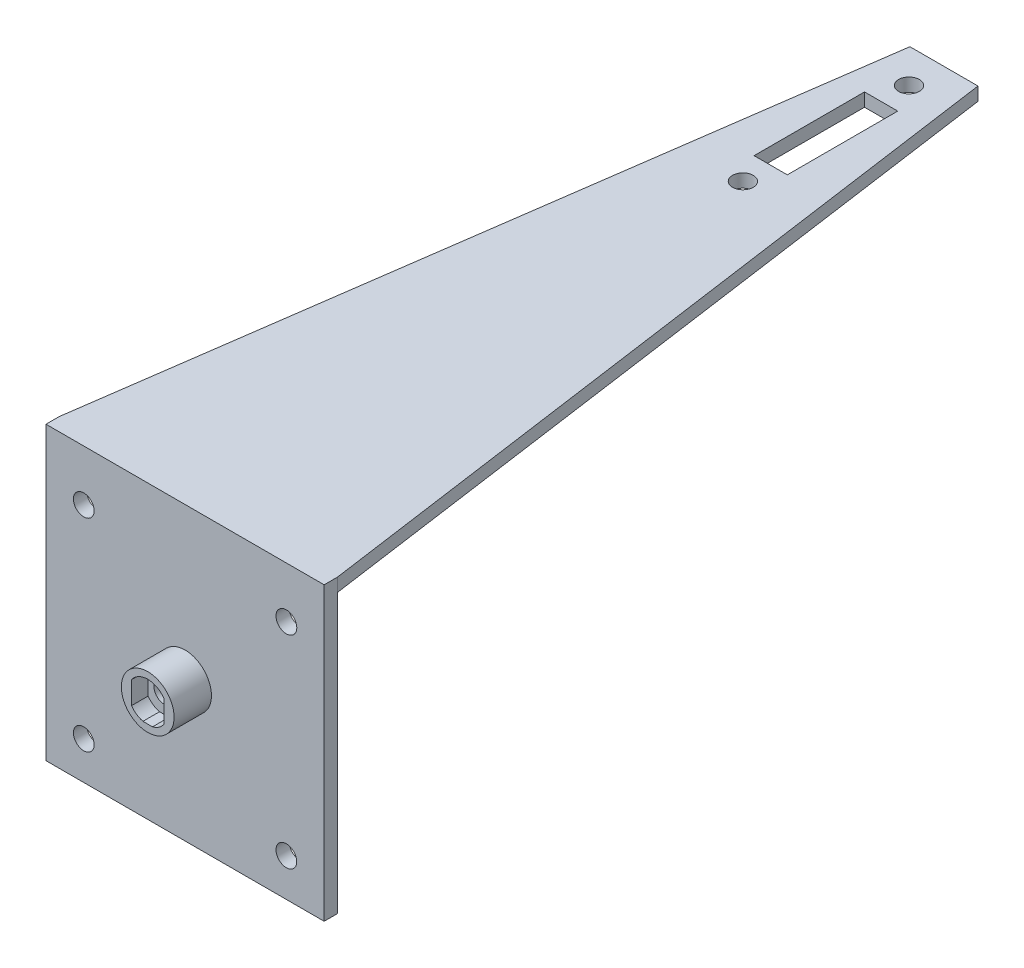
ISO-10303-21;
HEADER;
FILE_DESCRIPTION(('STEP AP214'),'2;1');
FILE_NAME('part.step','',(''),(''),'','','');
FILE_SCHEMA(('AUTOMOTIVE_DESIGN { 1 0 10303 214 1 1 1 1 }'));
ENDSEC;
DATA;
#1=APPLICATION_CONTEXT('core data for automotive mechanical design processes');
#2=APPLICATION_PROTOCOL_DEFINITION('international standard','automotive_design',2000,#1);
#3=PRODUCT_CONTEXT('',#1,'mechanical');
#4=PRODUCT('Part','Part','',(#3));
#5=PRODUCT_RELATED_PRODUCT_CATEGORY('part','',(#4));
#6=PRODUCT_DEFINITION_FORMATION('','',#4);
#7=PRODUCT_DEFINITION_CONTEXT('part definition',#1,'design');
#8=PRODUCT_DEFINITION('design','',#6,#7);
#9=PRODUCT_DEFINITION_SHAPE('','',#8);
#10=(LENGTH_UNIT() NAMED_UNIT(*) SI_UNIT(.MILLI.,.METRE.));
#11=(NAMED_UNIT(*) PLANE_ANGLE_UNIT() SI_UNIT($,.RADIAN.));
#12=(NAMED_UNIT(*) SI_UNIT($,.STERADIAN.) SOLID_ANGLE_UNIT());
#13=UNCERTAINTY_MEASURE_WITH_UNIT(LENGTH_MEASURE(1.E-05),#10,'distance_accuracy_value','');
#14=(GEOMETRIC_REPRESENTATION_CONTEXT(3) GLOBAL_UNCERTAINTY_ASSIGNED_CONTEXT((#13)) GLOBAL_UNIT_ASSIGNED_CONTEXT((#10,
#11,#12)) REPRESENTATION_CONTEXT('',''));
#15=CARTESIAN_POINT('',(0.,0.,0.));
#16=DIRECTION('',(0.,0.,1.));
#17=DIRECTION('',(1.,0.,0.));
#18=AXIS2_PLACEMENT_3D('',#15,#16,#17);
#19=CARTESIAN_POINT('',(0.,-1.016,5.207));
#20=DIRECTION('',(0.,0.,-1.));
#21=DIRECTION('',(-1.,0.,0.));
#22=AXIS2_PLACEMENT_3D('',#19,#20,#21);
#23=PLANE('',#22);
#24=DIRECTION('',(0.,1.,0.));
#25=VECTOR('',#24,1.);
#26=CARTESIAN_POINT('',(-2.4765,-2.73783385159545,5.207));
#27=LINE('',#26,#25);
#28=CARTESIAN_POINT('',(-2.4765,-2.73783385159544,5.207));
#29=VERTEX_POINT('',#28);
#30=CARTESIAN_POINT('',(-2.4765,0.705833851595446,5.207));
#31=VERTEX_POINT('',#30);
#32=EDGE_CURVE('E353',#29,#31,#27,.T.);
#33=ORIENTED_EDGE('',*,*,#32,.F.);
#34=CARTESIAN_POINT('',(0.,-1.016,5.207));
#35=DIRECTION('',(0.,0.,-1.));
#36=DIRECTION('',(-1.,0.,0.));
#37=AXIS2_PLACEMENT_3D('',#34,#35,#36);
#38=CIRCLE('',#37,3.01625);
#39=CARTESIAN_POINT('',(-0.73264166917942,-3.94191870137945,5.207));
#40=VERTEX_POINT('',#39);
#41=EDGE_CURVE('E331',#29,#40,#38,.F.);
#42=ORIENTED_EDGE('',*,*,#41,.T.);
#43=DIRECTION('',(1.,0.,0.));
#44=VECTOR('',#43,1.);
#45=CARTESIAN_POINT('',(0.732641669179425,-3.94191870137945,5.207));
#46=LINE('',#45,#44);
#47=CARTESIAN_POINT('',(0.732641669179416,-3.94191870137945,5.207));
#48=VERTEX_POINT('',#47);
#49=EDGE_CURVE('E351',#48,#40,#46,.F.);
#50=ORIENTED_EDGE('',*,*,#49,.F.);
#51=CARTESIAN_POINT('',(0.,-1.016,5.207));
#52=DIRECTION('',(0.,0.,-1.));
#53=DIRECTION('',(-1.,0.,0.));
#54=AXIS2_PLACEMENT_3D('',#51,#52,#53);
#55=CIRCLE('',#54,3.01625);
#56=CARTESIAN_POINT('',(2.4765,-2.73783385159544,5.207));
#57=VERTEX_POINT('',#56);
#58=EDGE_CURVE('E338',#48,#57,#55,.F.);
#59=ORIENTED_EDGE('',*,*,#58,.T.);
#60=DIRECTION('',(0.,-1.,0.));
#61=VECTOR('',#60,1.);
#62=CARTESIAN_POINT('',(2.4765,0.705833851595444,5.207));
#63=LINE('',#62,#61);
#64=CARTESIAN_POINT('',(2.4765,0.705833851595442,5.207));
#65=VERTEX_POINT('',#64);
#66=EDGE_CURVE('E342',#65,#57,#63,.T.);
#67=ORIENTED_EDGE('',*,*,#66,.F.);
#68=CARTESIAN_POINT('',(0.,-1.016,5.207));
#69=DIRECTION('',(0.,0.,-1.));
#70=DIRECTION('',(-1.,0.,0.));
#71=AXIS2_PLACEMENT_3D('',#68,#69,#70);
#72=CIRCLE('',#71,3.01625);
#73=EDGE_CURVE('E349',#65,#31,#72,.F.);
#74=ORIENTED_EDGE('',*,*,#73,.T.);
#75=EDGE_LOOP('',(#33,#42,#50,#59,#67,#74));
#76=FACE_BOUND('',#75,.T.);
#77=CARTESIAN_POINT('',(0.,-1.016,5.207));
#78=DIRECTION('',(0.,0.,-1.));
#79=DIRECTION('',(-1.,0.,0.));
#80=AXIS2_PLACEMENT_3D('',#77,#78,#79);
#81=CIRCLE('',#80,1.5875);
#82=CARTESIAN_POINT('',(-1.5875,-1.016,5.207));
#83=VERTEX_POINT('',#82);
#84=EDGE_CURVE('E44',#83,#83,#81,.T.);
#85=ORIENTED_EDGE('',*,*,#84,.T.);
#86=EDGE_LOOP('',(#85));
#87=FACE_BOUND('',#86,.T.);
#88=ADVANCED_FACE('F41',(#76,#87),#23,.F.);
#89=CARTESIAN_POINT('',(0.732641669179425,-3.94191870137945,5.207));
#90=DIRECTION('',(0.,1.,0.));
#91=DIRECTION('',(0.,0.,1.));
#92=AXIS2_PLACEMENT_3D('',#89,#90,#91);
#93=PLANE('',#92);
#94=ORIENTED_EDGE('',*,*,#49,.T.);
#95=DIRECTION('',(0.,0.,-1.));
#96=VECTOR('',#95,1.);
#97=CARTESIAN_POINT('',(-0.732641669179427,-3.94191870137945,5.207));
#98=LINE('',#97,#96);
#99=CARTESIAN_POINT('',(-0.73264166917942,-3.94191870137945,7.747));
#100=VERTEX_POINT('',#99);
#101=EDGE_CURVE('E328',#40,#100,#98,.F.);
#102=ORIENTED_EDGE('',*,*,#101,.T.);
#103=DIRECTION('',(1.,0.,0.));
#104=VECTOR('',#103,1.);
#105=CARTESIAN_POINT('',(0.732641669179425,-3.94191870137945,7.747));
#106=LINE('',#105,#104);
#107=CARTESIAN_POINT('',(0.732641669179416,-3.94191870137945,7.747));
#108=VERTEX_POINT('',#107);
#109=EDGE_CURVE('E246',#100,#108,#106,.T.);
#110=ORIENTED_EDGE('',*,*,#109,.T.);
#111=DIRECTION('',(0.,0.,-1.));
#112=VECTOR('',#111,1.);
#113=CARTESIAN_POINT('',(0.732641669179426,-3.94191870137945,5.207));
#114=LINE('',#113,#112);
#115=EDGE_CURVE('E339',#108,#48,#114,.T.);
#116=ORIENTED_EDGE('',*,*,#115,.T.);
#117=EDGE_LOOP('',(#94,#102,#110,#116));
#118=FACE_BOUND('',#117,.T.);
#119=ADVANCED_FACE('F432',(#118),#93,.T.);
#120=CARTESIAN_POINT('',(0.,-1.016,-2.53345989472426));
#121=DIRECTION('',(0.,0.,-1.));
#122=DIRECTION('',(-1.,0.,0.));
#123=AXIS2_PLACEMENT_3D('',#120,#121,#122);
#124=CYLINDRICAL_SURFACE('',#123,1.5875);
#125=ORIENTED_EDGE('',*,*,#84,.F.);
#126=EDGE_LOOP('',(#125));
#127=FACE_BOUND('',#126,.T.);
#128=CARTESIAN_POINT('',(0.,-1.016,3.175));
#129=DIRECTION('',(0.,0.,-1.));
#130=DIRECTION('',(-1.,0.,0.));
#131=AXIS2_PLACEMENT_3D('',#128,#129,#130);
#132=CIRCLE('',#131,1.5875);
#133=CARTESIAN_POINT('',(-1.5875,-1.016,3.175));
#134=VERTEX_POINT('',#133);
#135=EDGE_CURVE('E327',#134,#134,#132,.T.);
#136=ORIENTED_EDGE('',*,*,#135,.T.);
#137=EDGE_LOOP('',(#136));
#138=FACE_BOUND('',#137,.T.);
#139=ADVANCED_FACE('F434',(#127,#138),#124,.F.);
#140=CARTESIAN_POINT('',(-2.4765,-2.73783385159545,5.207));
#141=DIRECTION('',(1.,0.,0.));
#142=DIRECTION('',(0.,0.,-1.));
#143=AXIS2_PLACEMENT_3D('',#140,#141,#142);
#144=PLANE('',#143);
#145=ORIENTED_EDGE('',*,*,#32,.T.);
#146=DIRECTION('',(0.,0.,-1.));
#147=VECTOR('',#146,1.);
#148=CARTESIAN_POINT('',(-2.4765,0.705833851595445,5.207));
#149=LINE('',#148,#147);
#150=CARTESIAN_POINT('',(-2.4765,0.705833851595446,7.747));
#151=VERTEX_POINT('',#150);
#152=EDGE_CURVE('E346',#31,#151,#149,.F.);
#153=ORIENTED_EDGE('',*,*,#152,.T.);
#154=DIRECTION('',(0.,1.,0.));
#155=VECTOR('',#154,1.);
#156=CARTESIAN_POINT('',(-2.4765,-1.016,7.747));
#157=LINE('',#156,#155);
#158=CARTESIAN_POINT('',(-2.4765,-2.73783385159544,7.747));
#159=VERTEX_POINT('',#158);
#160=EDGE_CURVE('E325',#159,#151,#157,.T.);
#161=ORIENTED_EDGE('',*,*,#160,.F.);
#162=DIRECTION('',(0.,0.,-1.));
#163=VECTOR('',#162,1.);
#164=CARTESIAN_POINT('',(-2.4765,-2.73783385159544,5.207));
#165=LINE('',#164,#163);
#166=EDGE_CURVE('E332',#159,#29,#165,.T.);
#167=ORIENTED_EDGE('',*,*,#166,.T.);
#168=EDGE_LOOP('',(#145,#153,#161,#167));
#169=FACE_BOUND('',#168,.T.);
#170=ADVANCED_FACE('F423',(#169),#144,.T.);
#171=CARTESIAN_POINT('',(0.,-1.016,5.207));
#172=DIRECTION('',(0.,0.,-1.));
#173=DIRECTION('',(-1.,0.,0.));
#174=AXIS2_PLACEMENT_3D('',#171,#172,#173);
#175=CYLINDRICAL_SURFACE('',#174,3.01625);
#176=ORIENTED_EDGE('',*,*,#152,.F.);
#177=ORIENTED_EDGE('',*,*,#73,.F.);
#178=DIRECTION('',(0.,0.,1.));
#179=VECTOR('',#178,1.);
#180=CARTESIAN_POINT('',(2.4765,0.705833851595444,5.207));
#181=LINE('',#180,#179);
#182=CARTESIAN_POINT('',(2.4765,0.705833851595442,7.747));
#183=VERTEX_POINT('',#182);
#184=EDGE_CURVE('E343',#183,#65,#181,.F.);
#185=ORIENTED_EDGE('',*,*,#184,.F.);
#186=CARTESIAN_POINT('',(0.,-1.016,7.747));
#187=DIRECTION('',(0.,0.,-1.));
#188=DIRECTION('',(-1.,0.,0.));
#189=AXIS2_PLACEMENT_3D('',#186,#187,#188);
#190=CIRCLE('',#189,3.01625);
#191=EDGE_CURVE('E324',#151,#183,#190,.T.);
#192=ORIENTED_EDGE('',*,*,#191,.F.);
#193=EDGE_LOOP('',(#176,#177,#185,#192));
#194=FACE_BOUND('',#193,.T.);
#195=ADVANCED_FACE('F410',(#194),#175,.F.);
#196=CARTESIAN_POINT('',(2.4765,0.705833851595444,5.207));
#197=DIRECTION('',(-1.,0.,0.));
#198=DIRECTION('',(0.,-1.,0.));
#199=AXIS2_PLACEMENT_3D('',#196,#197,#198);
#200=PLANE('',#199);
#201=ORIENTED_EDGE('',*,*,#66,.T.);
#202=DIRECTION('',(0.,0.,-1.));
#203=VECTOR('',#202,1.);
#204=CARTESIAN_POINT('',(2.4765,-2.73783385159544,5.207));
#205=LINE('',#204,#203);
#206=CARTESIAN_POINT('',(2.4765,-2.73783385159544,7.747));
#207=VERTEX_POINT('',#206);
#208=EDGE_CURVE('E335',#57,#207,#205,.F.);
#209=ORIENTED_EDGE('',*,*,#208,.T.);
#210=DIRECTION('',(0.,1.,0.));
#211=VECTOR('',#210,1.);
#212=CARTESIAN_POINT('',(2.4765,-1.016,7.747));
#213=LINE('',#212,#211);
#214=EDGE_CURVE('E321',#183,#207,#213,.F.);
#215=ORIENTED_EDGE('',*,*,#214,.F.);
#216=ORIENTED_EDGE('',*,*,#184,.T.);
#217=EDGE_LOOP('',(#201,#209,#215,#216));
#218=FACE_BOUND('',#217,.T.);
#219=ADVANCED_FACE('F414',(#218),#200,.T.);
#220=CARTESIAN_POINT('',(0.,-1.016,5.207));
#221=DIRECTION('',(0.,0.,-1.));
#222=DIRECTION('',(-1.,0.,0.));
#223=AXIS2_PLACEMENT_3D('',#220,#221,#222);
#224=CYLINDRICAL_SURFACE('',#223,3.01625);
#225=ORIENTED_EDGE('',*,*,#208,.F.);
#226=ORIENTED_EDGE('',*,*,#58,.F.);
#227=ORIENTED_EDGE('',*,*,#115,.F.);
#228=CARTESIAN_POINT('',(0.,-1.016,7.747));
#229=DIRECTION('',(0.,0.,-1.));
#230=DIRECTION('',(-1.,0.,0.));
#231=AXIS2_PLACEMENT_3D('',#228,#229,#230);
#232=CIRCLE('',#231,3.01625);
#233=EDGE_CURVE('E323',#207,#108,#232,.T.);
#234=ORIENTED_EDGE('',*,*,#233,.F.);
#235=EDGE_LOOP('',(#225,#226,#227,#234));
#236=FACE_BOUND('',#235,.T.);
#237=ADVANCED_FACE('F431',(#236),#224,.F.);
#238=CARTESIAN_POINT('',(0.,-1.016,5.207));
#239=DIRECTION('',(0.,0.,-1.));
#240=DIRECTION('',(-1.,0.,0.));
#241=AXIS2_PLACEMENT_3D('',#238,#239,#240);
#242=CYLINDRICAL_SURFACE('',#241,3.01625);
#243=ORIENTED_EDGE('',*,*,#101,.F.);
#244=ORIENTED_EDGE('',*,*,#41,.F.);
#245=ORIENTED_EDGE('',*,*,#166,.F.);
#246=CARTESIAN_POINT('',(0.,-1.016,7.747));
#247=DIRECTION('',(0.,0.,-1.));
#248=DIRECTION('',(-1.,0.,0.));
#249=AXIS2_PLACEMENT_3D('',#246,#247,#248);
#250=CIRCLE('',#249,3.01625);
#251=EDGE_CURVE('E391',#100,#159,#250,.T.);
#252=ORIENTED_EDGE('',*,*,#251,.F.);
#253=EDGE_LOOP('',(#243,#244,#245,#252));
#254=FACE_BOUND('',#253,.T.);
#255=ADVANCED_FACE('F426',(#254),#242,.F.);
#256=CARTESIAN_POINT('',(0.,-0.930181126093821,3.175));
#257=DIRECTION('',(0.,0.,1.));
#258=DIRECTION('',(1.,0.,0.));
#259=AXIS2_PLACEMENT_3D('',#256,#257,#258);
#260=PLANE('',#259);
#261=ORIENTED_EDGE('',*,*,#135,.F.);
#262=EDGE_LOOP('',(#261));
#263=FACE_BOUND('',#262,.T.);
#264=CARTESIAN_POINT('',(0.,-0.930181126093821,3.175));
#265=DIRECTION('',(0.,0.,1.));
#266=DIRECTION('',(1.,0.,0.));
#267=AXIS2_PLACEMENT_3D('',#264,#265,#266);
#268=CIRCLE('',#267,3.175);
#269=CARTESIAN_POINT('',(3.175,-0.930181126093821,3.175));
#270=VERTEX_POINT('',#269);
#271=EDGE_CURVE('E388',#270,#270,#268,.F.);
#272=ORIENTED_EDGE('',*,*,#271,.T.);
#273=EDGE_LOOP('',(#272));
#274=FACE_BOUND('',#273,.T.);
#275=ADVANCED_FACE('F514',(#263,#274),#260,.F.);
#276=CARTESIAN_POINT('',(0.,-1.016,7.747));
#277=DIRECTION('',(0.,0.,1.));
#278=DIRECTION('',(1.,0.,0.));
#279=AXIS2_PLACEMENT_3D('',#276,#277,#278);
#280=PLANE('',#279);
#281=ORIENTED_EDGE('',*,*,#109,.F.);
#282=ORIENTED_EDGE('',*,*,#251,.T.);
#283=ORIENTED_EDGE('',*,*,#160,.T.);
#284=ORIENTED_EDGE('',*,*,#191,.T.);
#285=ORIENTED_EDGE('',*,*,#214,.T.);
#286=ORIENTED_EDGE('',*,*,#233,.T.);
#287=EDGE_LOOP('',(#281,#282,#283,#284,#285,#286));
#288=FACE_BOUND('',#287,.T.);
#289=CARTESIAN_POINT('',(0.,-1.016,7.747));
#290=DIRECTION('',(0.,0.,1.));
#291=DIRECTION('',(1.,0.,0.));
#292=AXIS2_PLACEMENT_3D('',#289,#290,#291);
#293=CIRCLE('',#292,4.03225);
#294=CARTESIAN_POINT('',(4.03225,-1.016,7.747));
#295=VERTEX_POINT('',#294);
#296=EDGE_CURVE('E320',#295,#295,#293,.F.);
#297=ORIENTED_EDGE('',*,*,#296,.F.);
#298=EDGE_LOOP('',(#297));
#299=FACE_BOUND('',#298,.T.);
#300=ADVANCED_FACE('F418',(#288,#299),#280,.T.);
#301=CARTESIAN_POINT('',(0.,-0.930181126093821,3.175));
#302=DIRECTION('',(0.,0.,1.));
#303=DIRECTION('',(1.,0.,0.));
#304=AXIS2_PLACEMENT_3D('',#301,#302,#303);
#305=CYLINDRICAL_SURFACE('',#304,3.175);
#306=CARTESIAN_POINT('',(0.,-0.930181126093821,0.));
#307=DIRECTION('',(0.,0.,1.));
#308=DIRECTION('',(1.,0.,0.));
#309=AXIS2_PLACEMENT_3D('',#306,#307,#308);
#310=CIRCLE('',#309,3.175);
#311=CARTESIAN_POINT('',(3.175,-0.930181126093821,0.));
#312=VERTEX_POINT('',#311);
#313=EDGE_CURVE('E316',#312,#312,#310,.F.);
#314=ORIENTED_EDGE('',*,*,#313,.T.);
#315=EDGE_LOOP('',(#314));
#316=FACE_BOUND('',#315,.T.);
#317=ORIENTED_EDGE('',*,*,#271,.F.);
#318=EDGE_LOOP('',(#317));
#319=FACE_BOUND('',#318,.T.);
#320=ADVANCED_FACE('F507',(#316,#319),#305,.F.);
#321=CARTESIAN_POINT('',(0.,-1.016,7.747));
#322=DIRECTION('',(0.,0.,1.));
#323=DIRECTION('',(1.,0.,0.));
#324=AXIS2_PLACEMENT_3D('',#321,#322,#323);
#325=CYLINDRICAL_SURFACE('',#324,4.03225);
#326=ORIENTED_EDGE('',*,*,#296,.T.);
#327=EDGE_LOOP('',(#326));
#328=FACE_BOUND('',#327,.T.);
#329=CARTESIAN_POINT('',(0.,-1.016,2.032));
#330=DIRECTION('',(0.,0.,1.));
#331=DIRECTION('',(1.,0.,0.));
#332=AXIS2_PLACEMENT_3D('',#329,#330,#331);
#333=CIRCLE('',#332,4.03225);
#334=CARTESIAN_POINT('',(4.03225,-1.016,2.032));
#335=VERTEX_POINT('',#334);
#336=EDGE_CURVE('E298',#335,#335,#333,.F.);
#337=ORIENTED_EDGE('',*,*,#336,.F.);
#338=EDGE_LOOP('',(#337));
#339=FACE_BOUND('',#338,.T.);
#340=ADVANCED_FACE('F503',(#328,#339),#325,.T.);
#341=CARTESIAN_POINT('',(-15.494,-16.4973,0.));
#342=DIRECTION('',(0.,0.,-1.));
#343=DIRECTION('',(-1.,0.,0.));
#344=AXIS2_PLACEMENT_3D('',#341,#342,#343);
#345=CYLINDRICAL_SURFACE('',#344,1.5875);
#346=CARTESIAN_POINT('',(-15.494,-16.4973,0.));
#347=DIRECTION('',(0.,0.,-1.));
#348=DIRECTION('',(-1.,0.,0.));
#349=AXIS2_PLACEMENT_3D('',#346,#347,#348);
#350=CIRCLE('',#349,1.5875);
#351=CARTESIAN_POINT('',(-17.0815,-16.4973,0.));
#352=VERTEX_POINT('',#351);
#353=EDGE_CURVE('E373',#352,#352,#350,.T.);
#354=ORIENTED_EDGE('',*,*,#353,.T.);
#355=EDGE_LOOP('',(#354));
#356=FACE_BOUND('',#355,.T.);
#357=CARTESIAN_POINT('',(-15.494,-16.4973,2.032));
#358=DIRECTION('',(0.,0.,-1.));
#359=DIRECTION('',(-1.,0.,0.));
#360=AXIS2_PLACEMENT_3D('',#357,#358,#359);
#361=CIRCLE('',#360,1.5875);
#362=CARTESIAN_POINT('',(-17.0815,-16.4973,2.032));
#363=VERTEX_POINT('',#362);
#364=EDGE_CURVE('E366',#363,#363,#361,.T.);
#365=ORIENTED_EDGE('',*,*,#364,.F.);
#366=EDGE_LOOP('',(#365));
#367=FACE_BOUND('',#366,.T.);
#368=ADVANCED_FACE('F499',(#356,#367),#345,.F.);
#369=CARTESIAN_POINT('',(15.494,-16.4973,0.));
#370=DIRECTION('',(0.,0.,-1.));
#371=DIRECTION('',(-1.,0.,0.));
#372=AXIS2_PLACEMENT_3D('',#369,#370,#371);
#373=CYLINDRICAL_SURFACE('',#372,1.5875);
#374=CARTESIAN_POINT('',(15.494,-16.4973,0.));
#375=DIRECTION('',(0.,0.,-1.));
#376=DIRECTION('',(-1.,0.,0.));
#377=AXIS2_PLACEMENT_3D('',#374,#375,#376);
#378=CIRCLE('',#377,1.5875);
#379=CARTESIAN_POINT('',(13.9065,-16.4973,0.));
#380=VERTEX_POINT('',#379);
#381=EDGE_CURVE('E376',#380,#380,#378,.T.);
#382=ORIENTED_EDGE('',*,*,#381,.T.);
#383=EDGE_LOOP('',(#382));
#384=FACE_BOUND('',#383,.T.);
#385=CARTESIAN_POINT('',(15.494,-16.4973,2.032));
#386=DIRECTION('',(0.,0.,-1.));
#387=DIRECTION('',(-1.,0.,0.));
#388=AXIS2_PLACEMENT_3D('',#385,#386,#387);
#389=CIRCLE('',#388,1.5875);
#390=CARTESIAN_POINT('',(13.9065,-16.4973,2.032));
#391=VERTEX_POINT('',#390);
#392=EDGE_CURVE('E363',#391,#391,#389,.T.);
#393=ORIENTED_EDGE('',*,*,#392,.F.);
#394=EDGE_LOOP('',(#393));
#395=FACE_BOUND('',#394,.T.);
#396=ADVANCED_FACE('F495',(#384,#395),#373,.F.);
#397=CARTESIAN_POINT('',(15.494,14.4907,0.));
#398=DIRECTION('',(0.,0.,-1.));
#399=DIRECTION('',(-1.,0.,0.));
#400=AXIS2_PLACEMENT_3D('',#397,#398,#399);
#401=CYLINDRICAL_SURFACE('',#400,1.59131);
#402=CARTESIAN_POINT('',(15.494,14.4907,0.));
#403=DIRECTION('',(0.,0.,-1.));
#404=DIRECTION('',(-1.,0.,0.));
#405=AXIS2_PLACEMENT_3D('',#402,#403,#404);
#406=CIRCLE('',#405,1.59131);
#407=CARTESIAN_POINT('',(13.90269,14.4907,0.));
#408=VERTEX_POINT('',#407);
#409=EDGE_CURVE('E379',#408,#408,#406,.T.);
#410=ORIENTED_EDGE('',*,*,#409,.T.);
#411=EDGE_LOOP('',(#410));
#412=FACE_BOUND('',#411,.T.);
#413=CARTESIAN_POINT('',(15.494,14.4907,2.032));
#414=DIRECTION('',(0.,0.,-1.));
#415=DIRECTION('',(-1.,0.,0.));
#416=AXIS2_PLACEMENT_3D('',#413,#414,#415);
#417=CIRCLE('',#416,1.59131);
#418=CARTESIAN_POINT('',(13.90269,14.4907,2.032));
#419=VERTEX_POINT('',#418);
#420=EDGE_CURVE('E359',#419,#419,#417,.T.);
#421=ORIENTED_EDGE('',*,*,#420,.F.);
#422=EDGE_LOOP('',(#421));
#423=FACE_BOUND('',#422,.T.);
#424=ADVANCED_FACE('F491',(#412,#423),#401,.F.);
#425=CARTESIAN_POINT('',(-15.494,14.4907,0.));
#426=DIRECTION('',(0.,0.,-1.));
#427=DIRECTION('',(-1.,0.,0.));
#428=AXIS2_PLACEMENT_3D('',#425,#426,#427);
#429=CYLINDRICAL_SURFACE('',#428,1.5875);
#430=CARTESIAN_POINT('',(-15.494,14.4907,0.));
#431=DIRECTION('',(0.,0.,-1.));
#432=DIRECTION('',(-1.,0.,0.));
#433=AXIS2_PLACEMENT_3D('',#430,#431,#432);
#434=CIRCLE('',#433,1.5875);
#435=CARTESIAN_POINT('',(-17.0815,14.4907,0.));
#436=VERTEX_POINT('',#435);
#437=EDGE_CURVE('E319',#436,#436,#434,.T.);
#438=ORIENTED_EDGE('',*,*,#437,.T.);
#439=EDGE_LOOP('',(#438));
#440=FACE_BOUND('',#439,.T.);
#441=CARTESIAN_POINT('',(-15.494,14.4907,2.032));
#442=DIRECTION('',(0.,0.,-1.));
#443=DIRECTION('',(-1.,0.,0.));
#444=AXIS2_PLACEMENT_3D('',#441,#442,#443);
#445=CIRCLE('',#444,1.5875);
#446=CARTESIAN_POINT('',(-17.0815,14.4907,2.032));
#447=VERTEX_POINT('',#446);
#448=EDGE_CURVE('E293',#447,#447,#445,.T.);
#449=ORIENTED_EDGE('',*,*,#448,.F.);
#450=EDGE_LOOP('',(#449));
#451=FACE_BOUND('',#450,.T.);
#452=ADVANCED_FACE('F487',(#440,#451),#429,.F.);
#453=CARTESIAN_POINT('',(-21.2725,-22.2885,2.032));
#454=DIRECTION('',(0.,1.,0.));
#455=DIRECTION('',(-1.,0.,0.));
#456=AXIS2_PLACEMENT_3D('',#453,#454,#455);
#457=PLANE('',#456);
#458=DIRECTION('',(0.,0.,1.));
#459=VECTOR('',#458,1.);
#460=CARTESIAN_POINT('',(21.2725,-22.2885,2.032));
#461=LINE('',#460,#459);
#462=CARTESIAN_POINT('',(21.2725,-22.2885,0.));
#463=VERTEX_POINT('',#462);
#464=CARTESIAN_POINT('',(21.2725,-22.2885,2.032));
#465=VERTEX_POINT('',#464);
#466=EDGE_CURVE('E299',#463,#465,#461,.T.);
#467=ORIENTED_EDGE('',*,*,#466,.T.);
#468=DIRECTION('',(1.,0.,0.));
#469=VECTOR('',#468,1.);
#470=CARTESIAN_POINT('',(0.,-22.2885,2.032));
#471=LINE('',#470,#469);
#472=CARTESIAN_POINT('',(-21.2725,-22.2885,2.032));
#473=VERTEX_POINT('',#472);
#474=EDGE_CURVE('E291',#473,#465,#471,.T.);
#475=ORIENTED_EDGE('',*,*,#474,.F.);
#476=DIRECTION('',(0.,0.,1.));
#477=VECTOR('',#476,1.);
#478=CARTESIAN_POINT('',(-21.2725,-22.2885,2.032));
#479=LINE('',#478,#477);
#480=CARTESIAN_POINT('',(-21.2725,-22.2885,0.));
#481=VERTEX_POINT('',#480);
#482=EDGE_CURVE('E281',#473,#481,#479,.F.);
#483=ORIENTED_EDGE('',*,*,#482,.T.);
#484=DIRECTION('',(1.,0.,0.));
#485=VECTOR('',#484,1.);
#486=CARTESIAN_POINT('',(0.,-22.2885,0.));
#487=LINE('',#486,#485);
#488=EDGE_CURVE('E317',#481,#463,#487,.T.);
#489=ORIENTED_EDGE('',*,*,#488,.T.);
#490=EDGE_LOOP('',(#467,#475,#483,#489));
#491=FACE_BOUND('',#490,.T.);
#492=ADVANCED_FACE('F483',(#491),#457,.F.);
#493=CARTESIAN_POINT('',(0.,0.,0.));
#494=DIRECTION('',(0.,0.,1.));
#495=DIRECTION('',(1.,0.,0.));
#496=AXIS2_PLACEMENT_3D('',#493,#494,#495);
#497=PLANE('',#496);
#498=ORIENTED_EDGE('',*,*,#313,.F.);
#499=EDGE_LOOP('',(#498));
#500=FACE_BOUND('',#499,.T.);
#501=ORIENTED_EDGE('',*,*,#353,.F.);
#502=EDGE_LOOP('',(#501));
#503=FACE_BOUND('',#502,.T.);
#504=ORIENTED_EDGE('',*,*,#381,.F.);
#505=EDGE_LOOP('',(#504));
#506=FACE_BOUND('',#505,.T.);
#507=ORIENTED_EDGE('',*,*,#409,.F.);
#508=EDGE_LOOP('',(#507));
#509=FACE_BOUND('',#508,.T.);
#510=ORIENTED_EDGE('',*,*,#437,.F.);
#511=EDGE_LOOP('',(#510));
#512=FACE_BOUND('',#511,.T.);
#513=DIRECTION('',(0.,-1.,0.));
#514=VECTOR('',#513,1.);
#515=CARTESIAN_POINT('',(21.2725,-23.1775,0.));
#516=LINE('',#515,#514);
#517=CARTESIAN_POINT('',(21.2725,20.2565,0.));
#518=VERTEX_POINT('',#517);
#519=EDGE_CURVE('E302',#518,#463,#516,.T.);
#520=ORIENTED_EDGE('',*,*,#519,.T.);
#521=ORIENTED_EDGE('',*,*,#488,.F.);
#522=DIRECTION('',(0.,1.,0.));
#523=VECTOR('',#522,1.);
#524=CARTESIAN_POINT('',(-21.2725,23.1775,0.));
#525=LINE('',#524,#523);
#526=CARTESIAN_POINT('',(-21.2725,20.2565,0.));
#527=VERTEX_POINT('',#526);
#528=EDGE_CURVE('E277',#481,#527,#525,.T.);
#529=ORIENTED_EDGE('',*,*,#528,.T.);
#530=DIRECTION('',(1.,0.,0.));
#531=VECTOR('',#530,1.);
#532=CARTESIAN_POINT('',(21.2725,20.2565,0.));
#533=LINE('',#532,#531);
#534=EDGE_CURVE('E313',#527,#518,#533,.T.);
#535=ORIENTED_EDGE('',*,*,#534,.T.);
#536=EDGE_LOOP('',(#520,#521,#529,#535));
#537=FACE_BOUND('',#536,.T.);
#538=ADVANCED_FACE('F479',(#500,#503,#506,#509,#512,#537),#497,.F.);
#539=CARTESIAN_POINT('',(21.2725,20.2565,-114.046));
#540=DIRECTION('',(0.,1.,0.));
#541=DIRECTION('',(0.,0.,1.));
#542=AXIS2_PLACEMENT_3D('',#539,#540,#541);
#543=PLANE('',#542);
#544=DIRECTION('',(-1.,0.,0.));
#545=VECTOR('',#544,1.);
#546=CARTESIAN_POINT('',(21.2725,20.2565,-104.5845));
#547=LINE('',#546,#545);
#548=CARTESIAN_POINT('',(2.39096399074023,20.2565,-104.5845));
#549=VERTEX_POINT('',#548);
#550=CARTESIAN_POINT('',(-2.68903600925977,20.2565,-104.5845));
#551=VERTEX_POINT('',#550);
#552=EDGE_CURVE('E220',#549,#551,#547,.T.);
#553=ORIENTED_EDGE('',*,*,#552,.T.);
#554=DIRECTION('',(0.,0.,1.));
#555=VECTOR('',#554,1.);
#556=CARTESIAN_POINT('',(-2.68903600925977,20.2565,-114.046));
#557=LINE('',#556,#555);
#558=CARTESIAN_POINT('',(-2.68903600925977,20.2565,-87.6935));
#559=VERTEX_POINT('',#558);
#560=EDGE_CURVE('E224',#551,#559,#557,.T.);
#561=ORIENTED_EDGE('',*,*,#560,.T.);
#562=DIRECTION('',(1.,0.,0.));
#563=VECTOR('',#562,1.);
#564=CARTESIAN_POINT('',(21.2725,20.2565,-87.6935));
#565=LINE('',#564,#563);
#566=CARTESIAN_POINT('',(2.39096399074023,20.2565,-87.6935));
#567=VERTEX_POINT('',#566);
#568=EDGE_CURVE('E212',#559,#567,#565,.T.);
#569=ORIENTED_EDGE('',*,*,#568,.T.);
#570=DIRECTION('',(0.,0.,-1.));
#571=VECTOR('',#570,1.);
#572=CARTESIAN_POINT('',(2.39096399074023,20.2565,-114.046));
#573=LINE('',#572,#571);
#574=EDGE_CURVE('E186',#567,#549,#573,.T.);
#575=ORIENTED_EDGE('',*,*,#574,.T.);
#576=EDGE_LOOP('',(#553,#561,#569,#575));
#577=FACE_BOUND('',#576,.T.);
#578=DIRECTION('',(1.,0.,0.));
#579=VECTOR('',#578,1.);
#580=CARTESIAN_POINT('',(0.,20.2565,-114.046));
#581=LINE('',#580,#579);
#582=CARTESIAN_POINT('',(-5.207,20.2565,-114.046));
#583=VERTEX_POINT('',#582);
#584=CARTESIAN_POINT('',(5.207,20.2565,-114.046));
#585=VERTEX_POINT('',#584);
#586=EDGE_CURVE('E241',#583,#585,#581,.T.);
#587=ORIENTED_EDGE('',*,*,#586,.T.);
#588=DIRECTION('',(-0.13949136510665,0.,-0.990223287476458));
#589=VECTOR('',#588,1.);
#590=CARTESIAN_POINT('',(5.207,20.2565,-114.046));
#591=LINE('',#590,#589);
#592=EDGE_CURVE('E309',#518,#585,#591,.T.);
#593=ORIENTED_EDGE('',*,*,#592,.F.);
#594=ORIENTED_EDGE('',*,*,#534,.F.);
#595=DIRECTION('',(-0.13949136510665,0.,0.990223287476458));
#596=VECTOR('',#595,1.);
#597=CARTESIAN_POINT('',(-5.207,20.2565,-114.046));
#598=LINE('',#597,#596);
#599=EDGE_CURVE('E274',#583,#527,#598,.T.);
#600=ORIENTED_EDGE('',*,*,#599,.F.);
#601=EDGE_LOOP('',(#587,#593,#594,#600));
#602=FACE_BOUND('',#601,.T.);
#603=CARTESIAN_POINT('',(-0.149036009259765,20.2565,-83.439));
#604=DIRECTION('',(0.,-1.,0.));
#605=DIRECTION('',(0.,0.,-1.));
#606=AXIS2_PLACEMENT_3D('',#603,#604,#605);
#607=CIRCLE('',#606,1.5875);
#608=CARTESIAN_POINT('',(-0.149036009259765,20.2565,-85.0265));
#609=VERTEX_POINT('',#608);
#610=EDGE_CURVE('E233',#609,#609,#607,.T.);
#611=ORIENTED_EDGE('',*,*,#610,.F.);
#612=EDGE_LOOP('',(#611));
#613=FACE_BOUND('',#612,.T.);
#614=CARTESIAN_POINT('',(-0.149036009259765,20.2565,-108.839));
#615=DIRECTION('',(0.,-1.,0.));
#616=DIRECTION('',(0.,0.,-1.));
#617=AXIS2_PLACEMENT_3D('',#614,#615,#616);
#618=CIRCLE('',#617,1.5875);
#619=CARTESIAN_POINT('',(-0.149036009259765,20.2565,-110.4265));
#620=VERTEX_POINT('',#619);
#621=EDGE_CURVE('E228',#620,#620,#618,.T.);
#622=ORIENTED_EDGE('',*,*,#621,.F.);
#623=EDGE_LOOP('',(#622));
#624=FACE_BOUND('',#623,.T.);
#625=ADVANCED_FACE('F475',(#577,#602,#613,#624),#543,.F.);
#626=CARTESIAN_POINT('',(0.,0.,-114.046));
#627=DIRECTION('',(0.,0.,-1.));
#628=DIRECTION('',(-1.,0.,0.));
#629=AXIS2_PLACEMENT_3D('',#626,#627,#628);
#630=PLANE('',#629);
#631=ORIENTED_EDGE('',*,*,#586,.F.);
#632=DIRECTION('',(0.,1.,0.));
#633=VECTOR('',#632,1.);
#634=CARTESIAN_POINT('',(-5.207,22.2885,-114.046));
#635=LINE('',#634,#633);
#636=CARTESIAN_POINT('',(-5.207,22.2885,-114.046));
#637=VERTEX_POINT('',#636);
#638=EDGE_CURVE('E267',#637,#583,#635,.F.);
#639=ORIENTED_EDGE('',*,*,#638,.F.);
#640=DIRECTION('',(1.,0.,0.));
#641=VECTOR('',#640,1.);
#642=CARTESIAN_POINT('',(21.2725,22.2885,-114.046));
#643=LINE('',#642,#641);
#644=CARTESIAN_POINT('',(5.207,22.2885,-114.046));
#645=VERTEX_POINT('',#644);
#646=EDGE_CURVE('E263',#637,#645,#643,.T.);
#647=ORIENTED_EDGE('',*,*,#646,.T.);
#648=DIRECTION('',(0.,1.,0.));
#649=VECTOR('',#648,1.);
#650=CARTESIAN_POINT('',(5.207,22.2885,-114.046));
#651=LINE('',#650,#649);
#652=EDGE_CURVE('E306',#585,#645,#651,.T.);
#653=ORIENTED_EDGE('',*,*,#652,.F.);
#654=EDGE_LOOP('',(#631,#639,#647,#653));
#655=FACE_BOUND('',#654,.T.);
#656=ADVANCED_FACE('F471',(#655),#630,.T.);
#657=CARTESIAN_POINT('',(5.207,22.2885,-114.046));
#658=DIRECTION('',(0.990223287476458,0.,-0.13949136510665));
#659=DIRECTION('',(-0.13949136510665,0.,-0.990223287476458));
#660=AXIS2_PLACEMENT_3D('',#657,#658,#659);
#661=PLANE('',#660);
#662=DIRECTION('',(0.13949136510665,0.,0.990223287476458));
#663=VECTOR('',#662,1.);
#664=CARTESIAN_POINT('',(5.207,22.2885,-114.046));
#665=LINE('',#664,#663);
#666=CARTESIAN_POINT('',(21.2725,22.2885,0.));
#667=VERTEX_POINT('',#666);
#668=EDGE_CURVE('E259',#645,#667,#665,.T.);
#669=ORIENTED_EDGE('',*,*,#668,.T.);
#670=DIRECTION('',(0.,-1.,0.));
#671=VECTOR('',#670,1.);
#672=CARTESIAN_POINT('',(21.2725,-23.1775,0.));
#673=LINE('',#672,#671);
#674=EDGE_CURVE('E294',#667,#518,#673,.T.);
#675=ORIENTED_EDGE('',*,*,#674,.T.);
#676=ORIENTED_EDGE('',*,*,#592,.T.);
#677=ORIENTED_EDGE('',*,*,#652,.T.);
#678=EDGE_LOOP('',(#669,#675,#676,#677));
#679=FACE_BOUND('',#678,.T.);
#680=ADVANCED_FACE('F467',(#679),#661,.T.);
#681=CARTESIAN_POINT('',(21.2725,-23.1775,2.032));
#682=DIRECTION('',(-1.,0.,0.));
#683=DIRECTION('',(0.,-1.,0.));
#684=AXIS2_PLACEMENT_3D('',#681,#682,#683);
#685=PLANE('',#684);
#686=DIRECTION('',(0.,0.,1.));
#687=VECTOR('',#686,1.);
#688=CARTESIAN_POINT('',(21.2725,22.2885,2.032));
#689=LINE('',#688,#687);
#690=CARTESIAN_POINT('',(21.2725,22.2885,2.032));
#691=VERTEX_POINT('',#690);
#692=EDGE_CURVE('E255',#667,#691,#689,.T.);
#693=ORIENTED_EDGE('',*,*,#692,.T.);
#694=DIRECTION('',(0.,1.,0.));
#695=VECTOR('',#694,1.);
#696=CARTESIAN_POINT('',(21.2725,0.,2.032));
#697=LINE('',#696,#695);
#698=EDGE_CURVE('E288',#465,#691,#697,.T.);
#699=ORIENTED_EDGE('',*,*,#698,.F.);
#700=ORIENTED_EDGE('',*,*,#466,.F.);
#701=ORIENTED_EDGE('',*,*,#519,.F.);
#702=ORIENTED_EDGE('',*,*,#674,.F.);
#703=EDGE_LOOP('',(#693,#699,#700,#701,#702));
#704=FACE_BOUND('',#703,.T.);
#705=ADVANCED_FACE('F463',(#704),#685,.F.);
#706=CARTESIAN_POINT('',(0.,0.,2.032));
#707=DIRECTION('',(0.,0.,1.));
#708=DIRECTION('',(1.,0.,0.));
#709=AXIS2_PLACEMENT_3D('',#706,#707,#708);
#710=PLANE('',#709);
#711=ORIENTED_EDGE('',*,*,#698,.T.);
#712=DIRECTION('',(1.,0.,0.));
#713=VECTOR('',#712,1.);
#714=CARTESIAN_POINT('',(21.2725,22.2885,2.032));
#715=LINE('',#714,#713);
#716=CARTESIAN_POINT('',(-21.2725,22.2885,2.032));
#717=VERTEX_POINT('',#716);
#718=EDGE_CURVE('E251',#691,#717,#715,.F.);
#719=ORIENTED_EDGE('',*,*,#718,.T.);
#720=DIRECTION('',(0.,1.,0.));
#721=VECTOR('',#720,1.);
#722=CARTESIAN_POINT('',(-21.2725,23.1775,2.032));
#723=LINE('',#722,#721);
#724=EDGE_CURVE('E284',#717,#473,#723,.F.);
#725=ORIENTED_EDGE('',*,*,#724,.T.);
#726=ORIENTED_EDGE('',*,*,#474,.T.);
#727=EDGE_LOOP('',(#711,#719,#725,#726));
#728=FACE_BOUND('',#727,.T.);
#729=ORIENTED_EDGE('',*,*,#448,.T.);
#730=EDGE_LOOP('',(#729));
#731=FACE_BOUND('',#730,.T.);
#732=ORIENTED_EDGE('',*,*,#420,.T.);
#733=EDGE_LOOP('',(#732));
#734=FACE_BOUND('',#733,.T.);
#735=ORIENTED_EDGE('',*,*,#392,.T.);
#736=EDGE_LOOP('',(#735));
#737=FACE_BOUND('',#736,.T.);
#738=ORIENTED_EDGE('',*,*,#364,.T.);
#739=EDGE_LOOP('',(#738));
#740=FACE_BOUND('',#739,.T.);
#741=ORIENTED_EDGE('',*,*,#336,.T.);
#742=EDGE_LOOP('',(#741));
#743=FACE_BOUND('',#742,.T.);
#744=ADVANCED_FACE('F459',(#728,#731,#734,#737,#740,#743),#710,.T.);
#745=CARTESIAN_POINT('',(-21.2725,23.1775,2.032));
#746=DIRECTION('',(1.,0.,0.));
#747=DIRECTION('',(0.,1.,0.));
#748=AXIS2_PLACEMENT_3D('',#745,#746,#747);
#749=PLANE('',#748);
#750=ORIENTED_EDGE('',*,*,#528,.F.);
#751=ORIENTED_EDGE('',*,*,#482,.F.);
#752=ORIENTED_EDGE('',*,*,#724,.F.);
#753=DIRECTION('',(0.,0.,1.));
#754=VECTOR('',#753,1.);
#755=CARTESIAN_POINT('',(-21.2725,22.2885,2.032));
#756=LINE('',#755,#754);
#757=CARTESIAN_POINT('',(-21.2725,22.2885,0.));
#758=VERTEX_POINT('',#757);
#759=EDGE_CURVE('E50',#717,#758,#756,.F.);
#760=ORIENTED_EDGE('',*,*,#759,.T.);
#761=DIRECTION('',(0.,1.,0.));
#762=VECTOR('',#761,1.);
#763=CARTESIAN_POINT('',(-21.2725,22.2885,0.));
#764=LINE('',#763,#762);
#765=EDGE_CURVE('E271',#527,#758,#764,.T.);
#766=ORIENTED_EDGE('',*,*,#765,.F.);
#767=EDGE_LOOP('',(#750,#751,#752,#760,#766));
#768=FACE_BOUND('',#767,.T.);
#769=ADVANCED_FACE('F452',(#768),#749,.F.);
#770=CARTESIAN_POINT('',(-5.207,22.2885,-114.046));
#771=DIRECTION('',(-0.990223287476458,0.,-0.13949136510665));
#772=DIRECTION('',(-0.13949136510665,0.,0.990223287476458));
#773=AXIS2_PLACEMENT_3D('',#770,#771,#772);
#774=PLANE('',#773);
#775=DIRECTION('',(0.13949136510665,0.,-0.990223287476458));
#776=VECTOR('',#775,1.);
#777=CARTESIAN_POINT('',(-21.2725,22.2885,0.));
#778=LINE('',#777,#776);
#779=EDGE_CURVE('E11',#758,#637,#778,.T.);
#780=ORIENTED_EDGE('',*,*,#779,.T.);
#781=ORIENTED_EDGE('',*,*,#638,.T.);
#782=ORIENTED_EDGE('',*,*,#599,.T.);
#783=ORIENTED_EDGE('',*,*,#765,.T.);
#784=EDGE_LOOP('',(#780,#781,#782,#783));
#785=FACE_BOUND('',#784,.T.);
#786=ADVANCED_FACE('F443',(#785),#774,.T.);
#787=CARTESIAN_POINT('',(21.2725,22.2885,2.032));
#788=DIRECTION('',(0.,-1.,0.));
#789=DIRECTION('',(1.,0.,0.));
#790=AXIS2_PLACEMENT_3D('',#787,#788,#789);
#791=PLANE('',#790);
#792=DIRECTION('',(1.,0.,0.));
#793=VECTOR('',#792,1.);
#794=CARTESIAN_POINT('',(-2.68903600925976,22.2885,-87.6935));
#795=LINE('',#794,#793);
#796=CARTESIAN_POINT('',(-2.68903600925977,22.2885,-87.6935));
#797=VERTEX_POINT('',#796);
#798=CARTESIAN_POINT('',(2.39096399074023,22.2885,-87.6935));
#799=VERTEX_POINT('',#798);
#800=EDGE_CURVE('E193',#797,#799,#795,.T.);
#801=ORIENTED_EDGE('',*,*,#800,.F.);
#802=DIRECTION('',(0.,0.,1.));
#803=VECTOR('',#802,1.);
#804=CARTESIAN_POINT('',(-2.68903600925977,22.2885,-104.5845));
#805=LINE('',#804,#803);
#806=CARTESIAN_POINT('',(-2.68903600925977,22.2885,-104.5845));
#807=VERTEX_POINT('',#806);
#808=EDGE_CURVE('E72',#807,#797,#805,.T.);
#809=ORIENTED_EDGE('',*,*,#808,.F.);
#810=DIRECTION('',(-1.,0.,0.));
#811=VECTOR('',#810,1.);
#812=CARTESIAN_POINT('',(-2.68903600925977,22.2885,-104.5845));
#813=LINE('',#812,#811);
#814=CARTESIAN_POINT('',(2.39096399074023,22.2885,-104.5845));
#815=VERTEX_POINT('',#814);
#816=EDGE_CURVE('E201',#815,#807,#813,.T.);
#817=ORIENTED_EDGE('',*,*,#816,.F.);
#818=DIRECTION('',(0.,0.,-1.));
#819=VECTOR('',#818,1.);
#820=CARTESIAN_POINT('',(2.39096399074023,22.2885,-104.5845));
#821=LINE('',#820,#819);
#822=EDGE_CURVE('E183',#799,#815,#821,.T.);
#823=ORIENTED_EDGE('',*,*,#822,.F.);
#824=EDGE_LOOP('',(#801,#809,#817,#823));
#825=FACE_BOUND('',#824,.T.);
#826=ORIENTED_EDGE('',*,*,#668,.F.);
#827=ORIENTED_EDGE('',*,*,#646,.F.);
#828=ORIENTED_EDGE('',*,*,#779,.F.);
#829=ORIENTED_EDGE('',*,*,#759,.F.);
#830=ORIENTED_EDGE('',*,*,#718,.F.);
#831=ORIENTED_EDGE('',*,*,#692,.F.);
#832=EDGE_LOOP('',(#826,#827,#828,#829,#830,#831));
#833=FACE_BOUND('',#832,.T.);
#834=CARTESIAN_POINT('',(-0.149036009259765,22.2885,-83.439));
#835=DIRECTION('',(0.,-1.,0.));
#836=DIRECTION('',(0.,0.,-1.));
#837=AXIS2_PLACEMENT_3D('',#834,#835,#836);
#838=CIRCLE('',#837,1.5875);
#839=CARTESIAN_POINT('',(-0.149036009259765,22.2885,-85.0265));
#840=VERTEX_POINT('',#839);
#841=EDGE_CURVE('E237',#840,#840,#838,.T.);
#842=ORIENTED_EDGE('',*,*,#841,.T.);
#843=EDGE_LOOP('',(#842));
#844=FACE_BOUND('',#843,.T.);
#845=CARTESIAN_POINT('',(-0.149036009259765,22.2885,-108.839));
#846=DIRECTION('',(0.,-1.,0.));
#847=DIRECTION('',(0.,0.,-1.));
#848=AXIS2_PLACEMENT_3D('',#845,#846,#847);
#849=CIRCLE('',#848,1.5875);
#850=CARTESIAN_POINT('',(-0.149036009259765,22.2885,-110.4265));
#851=VERTEX_POINT('',#850);
#852=EDGE_CURVE('E229',#851,#851,#849,.T.);
#853=ORIENTED_EDGE('',*,*,#852,.T.);
#854=EDGE_LOOP('',(#853));
#855=FACE_BOUND('',#854,.T.);
#856=ADVANCED_FACE('F198',(#825,#833,#844,#855),#791,.F.);
#857=CARTESIAN_POINT('',(-0.149036009259765,22.2885,-83.439));
#858=DIRECTION('',(0.,-1.,0.));
#859=DIRECTION('',(0.,0.,-1.));
#860=AXIS2_PLACEMENT_3D('',#857,#858,#859);
#861=CYLINDRICAL_SURFACE('',#860,1.5875);
#862=ORIENTED_EDGE('',*,*,#841,.F.);
#863=EDGE_LOOP('',(#862));
#864=FACE_BOUND('',#863,.T.);
#865=ORIENTED_EDGE('',*,*,#610,.T.);
#866=EDGE_LOOP('',(#865));
#867=FACE_BOUND('',#866,.T.);
#868=ADVANCED_FACE('F441',(#864,#867),#861,.F.);
#869=CARTESIAN_POINT('',(-0.149036009259765,22.2885,-108.839));
#870=DIRECTION('',(0.,-1.,0.));
#871=DIRECTION('',(0.,0.,-1.));
#872=AXIS2_PLACEMENT_3D('',#869,#870,#871);
#873=CYLINDRICAL_SURFACE('',#872,1.5875);
#874=ORIENTED_EDGE('',*,*,#852,.F.);
#875=EDGE_LOOP('',(#874));
#876=FACE_BOUND('',#875,.T.);
#877=ORIENTED_EDGE('',*,*,#621,.T.);
#878=EDGE_LOOP('',(#877));
#879=FACE_BOUND('',#878,.T.);
#880=ADVANCED_FACE('F449',(#876,#879),#873,.F.);
#881=CARTESIAN_POINT('',(-2.68903600925977,-22.2885,-104.5845));
#882=DIRECTION('',(-1.,0.,0.));
#883=DIRECTION('',(0.,-1.,0.));
#884=AXIS2_PLACEMENT_3D('',#881,#882,#883);
#885=PLANE('',#884);
#886=DIRECTION('',(0.,1.,0.));
#887=VECTOR('',#886,1.);
#888=CARTESIAN_POINT('',(-2.68903600925977,-22.2885,-104.5845));
#889=LINE('',#888,#887);
#890=EDGE_CURVE('E209',#551,#807,#889,.T.);
#891=ORIENTED_EDGE('',*,*,#890,.T.);
#892=ORIENTED_EDGE('',*,*,#808,.T.);
#893=DIRECTION('',(0.,1.,0.));
#894=VECTOR('',#893,1.);
#895=CARTESIAN_POINT('',(-2.68903600925977,-22.2885,-87.6935));
#896=LINE('',#895,#894);
#897=EDGE_CURVE('E190',#559,#797,#896,.T.);
#898=ORIENTED_EDGE('',*,*,#897,.F.);
#899=ORIENTED_EDGE('',*,*,#560,.F.);
#900=EDGE_LOOP('',(#891,#892,#898,#899));
#901=FACE_BOUND('',#900,.T.);
#902=ADVANCED_FACE('F631',(#901),#885,.F.);
#903=CARTESIAN_POINT('',(-2.68903600925977,-22.2885,-104.5845));
#904=DIRECTION('',(0.,0.,-1.));
#905=DIRECTION('',(-1.,0.,0.));
#906=AXIS2_PLACEMENT_3D('',#903,#904,#905);
#907=PLANE('',#906);
#908=DIRECTION('',(0.,1.,0.));
#909=VECTOR('',#908,1.);
#910=CARTESIAN_POINT('',(2.39096399074022,-22.2885,-104.5845));
#911=LINE('',#910,#909);
#912=EDGE_CURVE('E189',#549,#815,#911,.T.);
#913=ORIENTED_EDGE('',*,*,#912,.T.);
#914=ORIENTED_EDGE('',*,*,#816,.T.);
#915=ORIENTED_EDGE('',*,*,#890,.F.);
#916=ORIENTED_EDGE('',*,*,#552,.F.);
#917=EDGE_LOOP('',(#913,#914,#915,#916));
#918=FACE_BOUND('',#917,.T.);
#919=ADVANCED_FACE('F651',(#918),#907,.F.);
#920=CARTESIAN_POINT('',(2.39096399074022,-22.2885,-104.5845));
#921=DIRECTION('',(1.,0.,0.));
#922=DIRECTION('',(0.,1.,0.));
#923=AXIS2_PLACEMENT_3D('',#920,#921,#922);
#924=PLANE('',#923);
#925=DIRECTION('',(0.,1.,0.));
#926=VECTOR('',#925,1.);
#927=CARTESIAN_POINT('',(2.39096399074022,-22.2885,-87.6935));
#928=LINE('',#927,#926);
#929=EDGE_CURVE('E61',#567,#799,#928,.T.);
#930=ORIENTED_EDGE('',*,*,#929,.T.);
#931=ORIENTED_EDGE('',*,*,#822,.T.);
#932=ORIENTED_EDGE('',*,*,#912,.F.);
#933=ORIENTED_EDGE('',*,*,#574,.F.);
#934=EDGE_LOOP('',(#930,#931,#932,#933));
#935=FACE_BOUND('',#934,.T.);
#936=ADVANCED_FACE('F180',(#935),#924,.F.);
#937=CARTESIAN_POINT('',(-2.68903600925977,-22.2885,-87.6935));
#938=DIRECTION('',(0.,0.,1.));
#939=DIRECTION('',(1.,0.,0.));
#940=AXIS2_PLACEMENT_3D('',#937,#938,#939);
#941=PLANE('',#940);
#942=ORIENTED_EDGE('',*,*,#897,.T.);
#943=ORIENTED_EDGE('',*,*,#800,.T.);
#944=ORIENTED_EDGE('',*,*,#929,.F.);
#945=ORIENTED_EDGE('',*,*,#568,.F.);
#946=EDGE_LOOP('',(#942,#943,#944,#945));
#947=FACE_BOUND('',#946,.T.);
#948=ADVANCED_FACE('F194',(#947),#941,.F.);
#949=CLOSED_SHELL('',(#88,#119,#139,#170,#195,#219,#237,#255,#275,#300,#320,#340,#368,#396,#424,
#452,#492,#538,#625,#656,#680,#705,#744,#769,#786,#856,#868,#880,#902,#919,#936,#948));
#950=MANIFOLD_SOLID_BREP('B2',#949);
#951=ADVANCED_BREP_SHAPE_REPRESENTATION('',(#18,#950),#14);
#952=SHAPE_DEFINITION_REPRESENTATION(#9,#951);
ENDSEC;
END-ISO-10303-21;
